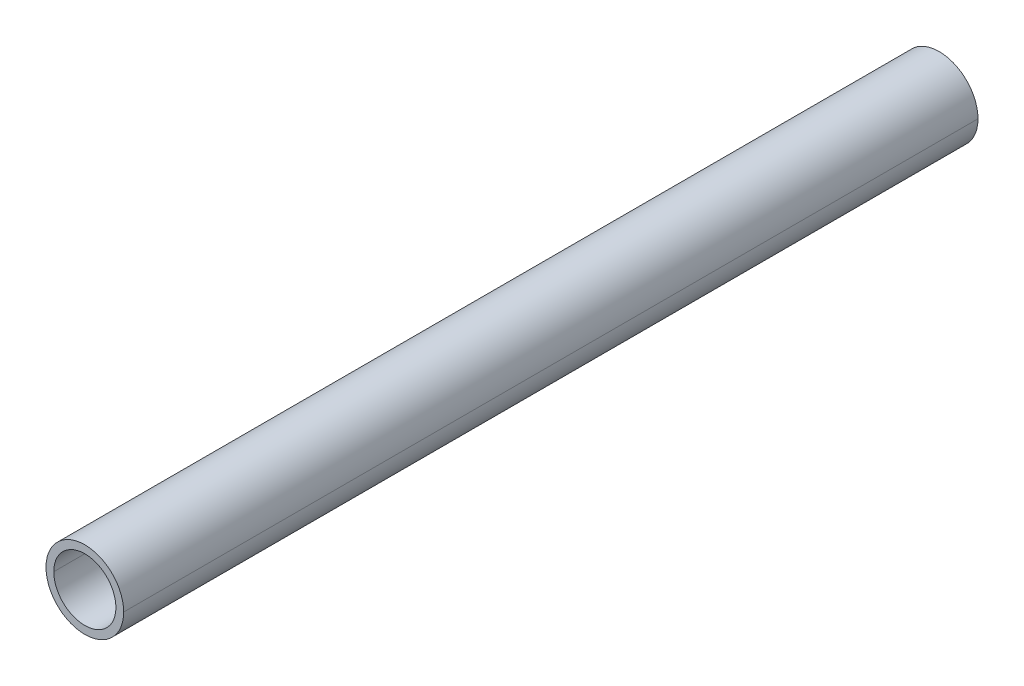
ISO-10303-21;
HEADER;
FILE_DESCRIPTION(('STEP AP214'),'2;1');
FILE_NAME('part.step','',(''),(''),'','','');
FILE_SCHEMA(('AUTOMOTIVE_DESIGN { 1 0 10303 214 1 1 1 1 }'));
ENDSEC;
DATA;
#1=APPLICATION_CONTEXT('core data for automotive mechanical design processes');
#2=APPLICATION_PROTOCOL_DEFINITION('international standard','automotive_design',2000,#1);
#3=PRODUCT_CONTEXT('',#1,'mechanical');
#4=PRODUCT('Part','Part','',(#3));
#5=PRODUCT_RELATED_PRODUCT_CATEGORY('part','',(#4));
#6=PRODUCT_DEFINITION_FORMATION('','',#4);
#7=PRODUCT_DEFINITION_CONTEXT('part definition',#1,'design');
#8=PRODUCT_DEFINITION('design','',#6,#7);
#9=PRODUCT_DEFINITION_SHAPE('','',#8);
#10=(LENGTH_UNIT() NAMED_UNIT(*) SI_UNIT(.MILLI.,.METRE.));
#11=(NAMED_UNIT(*) PLANE_ANGLE_UNIT() SI_UNIT($,.RADIAN.));
#12=(NAMED_UNIT(*) SI_UNIT($,.STERADIAN.) SOLID_ANGLE_UNIT());
#13=UNCERTAINTY_MEASURE_WITH_UNIT(LENGTH_MEASURE(1.E-05),#10,'distance_accuracy_value','');
#14=(GEOMETRIC_REPRESENTATION_CONTEXT(3) GLOBAL_UNCERTAINTY_ASSIGNED_CONTEXT((#13)) GLOBAL_UNIT_ASSIGNED_CONTEXT((#10,
#11,#12)) REPRESENTATION_CONTEXT('',''));
#15=CARTESIAN_POINT('',(0.,0.,0.));
#16=DIRECTION('',(0.,0.,1.));
#17=DIRECTION('',(1.,0.,0.));
#18=AXIS2_PLACEMENT_3D('',#15,#16,#17);
#19=CARTESIAN_POINT('',(0.,0.,0.));
#20=DIRECTION('',(0.,0.,1.));
#21=DIRECTION('',(1.,0.,0.));
#22=AXIS2_PLACEMENT_3D('',#19,#20,#21);
#23=CYLINDRICAL_SURFACE('',#22,5.);
#24=DIRECTION('',(0.,0.,1.));
#25=VECTOR('',#24,1.);
#26=CARTESIAN_POINT('',(5.,0.,0.));
#27=LINE('',#26,#25);
#28=CARTESIAN_POINT('',(5.,0.,-55.));
#29=VERTEX_POINT('',#28);
#30=CARTESIAN_POINT('',(5.,0.,55.));
#31=VERTEX_POINT('',#30);
#32=EDGE_CURVE('E11',#29,#31,#27,.T.);
#33=ORIENTED_EDGE('',*,*,#32,.F.);
#34=CARTESIAN_POINT('',(0.,0.,-55.));
#35=DIRECTION('',(0.,0.,1.));
#36=DIRECTION('',(1.,0.,0.));
#37=AXIS2_PLACEMENT_3D('',#34,#35,#36);
#38=CIRCLE('',#37,5.);
#39=CARTESIAN_POINT('',(-5.,0.,-55.));
#40=VERTEX_POINT('',#39);
#41=EDGE_CURVE('E101',#29,#40,#38,.T.);
#42=ORIENTED_EDGE('',*,*,#41,.T.);
#43=DIRECTION('',(0.,0.,1.));
#44=VECTOR('',#43,1.);
#45=CARTESIAN_POINT('',(-5.,0.,0.));
#46=LINE('',#45,#44);
#47=CARTESIAN_POINT('',(-5.,0.,55.));
#48=VERTEX_POINT('',#47);
#49=EDGE_CURVE('E20',#40,#48,#46,.T.);
#50=ORIENTED_EDGE('',*,*,#49,.T.);
#51=CARTESIAN_POINT('',(0.,0.,55.));
#52=DIRECTION('',(0.,0.,1.));
#53=DIRECTION('',(1.,0.,0.));
#54=AXIS2_PLACEMENT_3D('',#51,#52,#53);
#55=CIRCLE('',#54,5.);
#56=EDGE_CURVE('E97',#31,#48,#55,.T.);
#57=ORIENTED_EDGE('',*,*,#56,.F.);
#58=EDGE_LOOP('',(#33,#42,#50,#57));
#59=FACE_BOUND('',#58,.T.);
#60=ADVANCED_FACE('F16',(#59),#23,.T.);
#61=CARTESIAN_POINT('',(0.,0.,0.));
#62=DIRECTION('',(0.,0.,1.));
#63=DIRECTION('',(1.,0.,0.));
#64=AXIS2_PLACEMENT_3D('',#61,#62,#63);
#65=CYLINDRICAL_SURFACE('',#64,5.);
#66=ORIENTED_EDGE('',*,*,#49,.F.);
#67=CARTESIAN_POINT('',(0.,0.,-55.));
#68=DIRECTION('',(0.,0.,1.));
#69=DIRECTION('',(1.,0.,0.));
#70=AXIS2_PLACEMENT_3D('',#67,#68,#69);
#71=CIRCLE('',#70,5.);
#72=EDGE_CURVE('E84',#40,#29,#71,.T.);
#73=ORIENTED_EDGE('',*,*,#72,.T.);
#74=ORIENTED_EDGE('',*,*,#32,.T.);
#75=CARTESIAN_POINT('',(0.,0.,55.));
#76=DIRECTION('',(0.,0.,1.));
#77=DIRECTION('',(1.,0.,0.));
#78=AXIS2_PLACEMENT_3D('',#75,#76,#77);
#79=CIRCLE('',#78,5.);
#80=EDGE_CURVE('E89',#48,#31,#79,.T.);
#81=ORIENTED_EDGE('',*,*,#80,.F.);
#82=EDGE_LOOP('',(#66,#73,#74,#81));
#83=FACE_BOUND('',#82,.T.);
#84=ADVANCED_FACE('F123',(#83),#65,.T.);
#85=CARTESIAN_POINT('',(0.,0.,0.));
#86=DIRECTION('',(0.,0.,1.));
#87=DIRECTION('',(1.,0.,0.));
#88=AXIS2_PLACEMENT_3D('',#85,#86,#87);
#89=CYLINDRICAL_SURFACE('',#88,4.);
#90=CARTESIAN_POINT('',(0.,0.,55.));
#91=DIRECTION('',(0.,0.,1.));
#92=DIRECTION('',(1.,0.,0.));
#93=AXIS2_PLACEMENT_3D('',#90,#91,#92);
#94=CIRCLE('',#93,4.);
#95=CARTESIAN_POINT('',(-4.,0.,55.));
#96=VERTEX_POINT('',#95);
#97=CARTESIAN_POINT('',(4.,0.,55.));
#98=VERTEX_POINT('',#97);
#99=EDGE_CURVE('E74',#96,#98,#94,.T.);
#100=ORIENTED_EDGE('',*,*,#99,.T.);
#101=DIRECTION('',(0.,0.,1.));
#102=VECTOR('',#101,1.);
#103=CARTESIAN_POINT('',(4.,0.,0.));
#104=LINE('',#103,#102);
#105=CARTESIAN_POINT('',(4.,0.,-55.));
#106=VERTEX_POINT('',#105);
#107=EDGE_CURVE('E48',#106,#98,#104,.T.);
#108=ORIENTED_EDGE('',*,*,#107,.F.);
#109=CARTESIAN_POINT('',(0.,0.,-55.));
#110=DIRECTION('',(0.,0.,1.));
#111=DIRECTION('',(1.,0.,0.));
#112=AXIS2_PLACEMENT_3D('',#109,#110,#111);
#113=CIRCLE('',#112,4.);
#114=CARTESIAN_POINT('',(-4.,0.,-55.));
#115=VERTEX_POINT('',#114);
#116=EDGE_CURVE('E75',#115,#106,#113,.T.);
#117=ORIENTED_EDGE('',*,*,#116,.F.);
#118=DIRECTION('',(0.,0.,1.));
#119=VECTOR('',#118,1.);
#120=CARTESIAN_POINT('',(-4.,0.,0.));
#121=LINE('',#120,#119);
#122=EDGE_CURVE('E38',#115,#96,#121,.T.);
#123=ORIENTED_EDGE('',*,*,#122,.T.);
#124=EDGE_LOOP('',(#100,#108,#117,#123));
#125=FACE_BOUND('',#124,.T.);
#126=ADVANCED_FACE('F72',(#125),#89,.F.);
#127=CARTESIAN_POINT('',(0.,0.,0.));
#128=DIRECTION('',(0.,0.,1.));
#129=DIRECTION('',(1.,0.,0.));
#130=AXIS2_PLACEMENT_3D('',#127,#128,#129);
#131=CYLINDRICAL_SURFACE('',#130,4.);
#132=CARTESIAN_POINT('',(0.,0.,55.));
#133=DIRECTION('',(0.,0.,1.));
#134=DIRECTION('',(1.,0.,0.));
#135=AXIS2_PLACEMENT_3D('',#132,#133,#134);
#136=CIRCLE('',#135,4.);
#137=EDGE_CURVE('E80',#98,#96,#136,.T.);
#138=ORIENTED_EDGE('',*,*,#137,.T.);
#139=ORIENTED_EDGE('',*,*,#122,.F.);
#140=CARTESIAN_POINT('',(0.,0.,-55.));
#141=DIRECTION('',(0.,0.,1.));
#142=DIRECTION('',(1.,0.,0.));
#143=AXIS2_PLACEMENT_3D('',#140,#141,#142);
#144=CIRCLE('',#143,4.);
#145=EDGE_CURVE('E104',#106,#115,#144,.T.);
#146=ORIENTED_EDGE('',*,*,#145,.F.);
#147=ORIENTED_EDGE('',*,*,#107,.T.);
#148=EDGE_LOOP('',(#138,#139,#146,#147));
#149=FACE_BOUND('',#148,.T.);
#150=ADVANCED_FACE('F81',(#149),#131,.F.);
#151=CARTESIAN_POINT('',(0.,0.,-55.));
#152=DIRECTION('',(0.,0.,1.));
#153=DIRECTION('',(1.,0.,0.));
#154=AXIS2_PLACEMENT_3D('',#151,#152,#153);
#155=PLANE('',#154);
#156=ORIENTED_EDGE('',*,*,#145,.T.);
#157=ORIENTED_EDGE('',*,*,#116,.T.);
#158=EDGE_LOOP('',(#156,#157));
#159=FACE_BOUND('',#158,.T.);
#160=ORIENTED_EDGE('',*,*,#72,.F.);
#161=ORIENTED_EDGE('',*,*,#41,.F.);
#162=EDGE_LOOP('',(#160,#161));
#163=FACE_BOUND('',#162,.T.);
#164=ADVANCED_FACE('F18',(#159,#163),#155,.F.);
#165=CARTESIAN_POINT('',(0.,0.,55.));
#166=DIRECTION('',(0.,0.,1.));
#167=DIRECTION('',(1.,0.,0.));
#168=AXIS2_PLACEMENT_3D('',#165,#166,#167);
#169=PLANE('',#168);
#170=ORIENTED_EDGE('',*,*,#99,.F.);
#171=ORIENTED_EDGE('',*,*,#137,.F.);
#172=EDGE_LOOP('',(#170,#171));
#173=FACE_BOUND('',#172,.T.);
#174=ORIENTED_EDGE('',*,*,#56,.T.);
#175=ORIENTED_EDGE('',*,*,#80,.T.);
#176=EDGE_LOOP('',(#174,#175));
#177=FACE_BOUND('',#176,.T.);
#178=ADVANCED_FACE('F86',(#173,#177),#169,.T.);
#179=CLOSED_SHELL('',(#60,#84,#126,#150,#164,#178));
#180=MANIFOLD_SOLID_BREP('B1',#179);
#181=ADVANCED_BREP_SHAPE_REPRESENTATION('',(#18,#180),#14);
#182=SHAPE_DEFINITION_REPRESENTATION(#9,#181);
ENDSEC;
END-ISO-10303-21;
